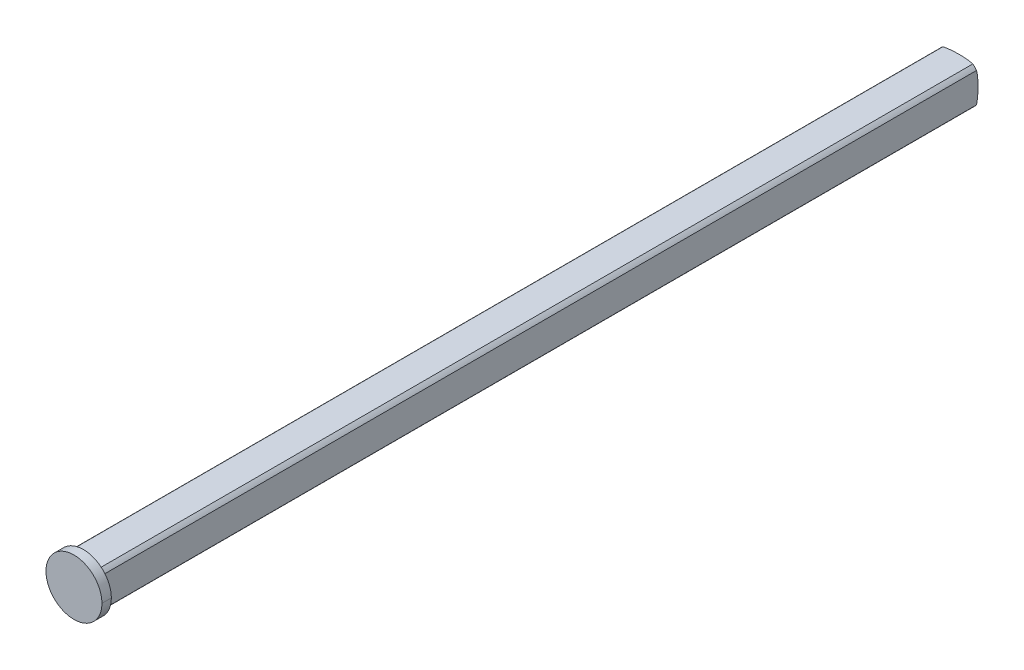
ISO-10303-21;
HEADER;
FILE_DESCRIPTION(('STEP AP214'),'2;1');
FILE_NAME('part.step','',(''),(''),'','','');
FILE_SCHEMA(('AUTOMOTIVE_DESIGN { 1 0 10303 214 1 1 1 1 }'));
ENDSEC;
DATA;
#1=APPLICATION_CONTEXT('core data for automotive mechanical design processes');
#2=APPLICATION_PROTOCOL_DEFINITION('international standard','automotive_design',2000,#1);
#3=PRODUCT_CONTEXT('',#1,'mechanical');
#4=PRODUCT('Part','Part','',(#3));
#5=PRODUCT_RELATED_PRODUCT_CATEGORY('part','',(#4));
#6=PRODUCT_DEFINITION_FORMATION('','',#4);
#7=PRODUCT_DEFINITION_CONTEXT('part definition',#1,'design');
#8=PRODUCT_DEFINITION('design','',#6,#7);
#9=PRODUCT_DEFINITION_SHAPE('','',#8);
#10=(LENGTH_UNIT() NAMED_UNIT(*) SI_UNIT(.MILLI.,.METRE.));
#11=(NAMED_UNIT(*) PLANE_ANGLE_UNIT() SI_UNIT($,.RADIAN.));
#12=(NAMED_UNIT(*) SI_UNIT($,.STERADIAN.) SOLID_ANGLE_UNIT());
#13=UNCERTAINTY_MEASURE_WITH_UNIT(LENGTH_MEASURE(1.E-05),#10,'distance_accuracy_value','');
#14=(GEOMETRIC_REPRESENTATION_CONTEXT(3) GLOBAL_UNCERTAINTY_ASSIGNED_CONTEXT((#13)) GLOBAL_UNIT_ASSIGNED_CONTEXT((#10,
#11,#12)) REPRESENTATION_CONTEXT('',''));
#15=CARTESIAN_POINT('',(0.,0.,0.));
#16=DIRECTION('',(0.,0.,1.));
#17=DIRECTION('',(1.,0.,0.));
#18=AXIS2_PLACEMENT_3D('',#15,#16,#17);
#19=CARTESIAN_POINT('',(0.,0.,-74.422));
#20=DIRECTION('',(0.,0.,1.));
#21=DIRECTION('',(1.,0.,0.));
#22=AXIS2_PLACEMENT_3D('',#19,#20,#21);
#23=CYLINDRICAL_SURFACE('',#22,2.032);
#24=DIRECTION('',(0.,0.,-1.));
#25=VECTOR('',#24,1.);
#26=CARTESIAN_POINT('',(1.5875,1.26841150657032,-74.422));
#27=LINE('',#26,#25);
#28=CARTESIAN_POINT('',(1.5875,1.26841150657032,0.));
#29=VERTEX_POINT('',#28);
#30=CARTESIAN_POINT('',(1.5875,1.26841150657032,-74.270919142098));
#31=VERTEX_POINT('',#30);
#32=EDGE_CURVE('P0_E145',#29,#31,#27,.T.);
#33=ORIENTED_EDGE('',*,*,#32,.T.);
#34=CARTESIAN_POINT('',(0.,0.,-74.270919142098));
#35=DIRECTION('',(0.,0.,1.));
#36=DIRECTION('',(1.,0.,0.));
#37=AXIS2_PLACEMENT_3D('',#34,#35,#36);
#38=CIRCLE('',#37,2.032);
#39=CARTESIAN_POINT('',(1.26841150657032,1.5875,-74.270919142098));
#40=VERTEX_POINT('',#39);
#41=EDGE_CURVE('P0_E160',#31,#40,#38,.T.);
#42=ORIENTED_EDGE('',*,*,#41,.T.);
#43=DIRECTION('',(0.,0.,1.));
#44=VECTOR('',#43,1.);
#45=CARTESIAN_POINT('',(1.26841150657032,1.5875,-74.422));
#46=LINE('',#45,#44);
#47=CARTESIAN_POINT('',(1.26841150657032,1.5875,0.));
#48=VERTEX_POINT('',#47);
#49=EDGE_CURVE('P0_E194',#40,#48,#46,.T.);
#50=ORIENTED_EDGE('',*,*,#49,.T.);
#51=CARTESIAN_POINT('',(0.,0.,0.));
#52=DIRECTION('',(0.,0.,1.));
#53=DIRECTION('',(1.,0.,0.));
#54=AXIS2_PLACEMENT_3D('',#51,#52,#53);
#55=CIRCLE('',#54,2.032);
#56=EDGE_CURVE('P0_E316',#29,#48,#55,.T.);
#57=ORIENTED_EDGE('',*,*,#56,.F.);
#58=EDGE_LOOP('',(#33,#42,#50,#57));
#59=FACE_BOUND('',#58,.T.);
#60=ADVANCED_FACE('P0_F17',(#59),#23,.T.);
#61=CARTESIAN_POINT('',(0.,0.,-74.422));
#62=DIRECTION('',(0.,0.,1.));
#63=DIRECTION('',(1.,0.,0.));
#64=AXIS2_PLACEMENT_3D('',#61,#62,#63);
#65=CYLINDRICAL_SURFACE('',#64,2.032);
#66=DIRECTION('',(0.,0.,1.));
#67=VECTOR('',#66,1.);
#68=CARTESIAN_POINT('',(-1.5875,1.26841150657032,-74.422));
#69=LINE('',#68,#67);
#70=CARTESIAN_POINT('',(-1.5875,1.26841150657032,-74.270919142098));
#71=VERTEX_POINT('',#70);
#72=CARTESIAN_POINT('',(-1.5875,1.26841150657032,0.));
#73=VERTEX_POINT('',#72);
#74=EDGE_CURVE('P0_E154',#71,#73,#69,.T.);
#75=ORIENTED_EDGE('',*,*,#74,.T.);
#76=CARTESIAN_POINT('',(0.,0.,0.));
#77=DIRECTION('',(0.,0.,1.));
#78=DIRECTION('',(1.,0.,0.));
#79=AXIS2_PLACEMENT_3D('',#76,#77,#78);
#80=CIRCLE('',#79,2.032);
#81=CARTESIAN_POINT('',(-1.26841150657032,1.5875,0.));
#82=VERTEX_POINT('',#81);
#83=EDGE_CURVE('P0_E44',#82,#73,#80,.T.);
#84=ORIENTED_EDGE('',*,*,#83,.F.);
#85=DIRECTION('',(0.,0.,-1.));
#86=VECTOR('',#85,1.);
#87=CARTESIAN_POINT('',(-1.26841150657032,1.5875,-74.422));
#88=LINE('',#87,#86);
#89=CARTESIAN_POINT('',(-1.26841150657032,1.5875,-74.270919142098));
#90=VERTEX_POINT('',#89);
#91=EDGE_CURVE('P0_E203',#82,#90,#88,.T.);
#92=ORIENTED_EDGE('',*,*,#91,.T.);
#93=CARTESIAN_POINT('',(0.,0.,-74.270919142098));
#94=DIRECTION('',(0.,0.,1.));
#95=DIRECTION('',(1.,0.,0.));
#96=AXIS2_PLACEMENT_3D('',#93,#94,#95);
#97=CIRCLE('',#96,2.032);
#98=EDGE_CURVE('P0_E212',#90,#71,#97,.T.);
#99=ORIENTED_EDGE('',*,*,#98,.T.);
#100=EDGE_LOOP('',(#75,#84,#92,#99));
#101=FACE_BOUND('',#100,.T.);
#102=ADVANCED_FACE('P0_F236',(#101),#65,.T.);
#103=CARTESIAN_POINT('',(0.,0.,-74.422));
#104=DIRECTION('',(0.,0.,1.));
#105=DIRECTION('',(1.,0.,0.));
#106=AXIS2_PLACEMENT_3D('',#103,#104,#105);
#107=CYLINDRICAL_SURFACE('',#106,2.032);
#108=DIRECTION('',(0.,0.,-1.));
#109=VECTOR('',#108,1.);
#110=CARTESIAN_POINT('',(-1.5875,-1.26841150657032,-74.422));
#111=LINE('',#110,#109);
#112=CARTESIAN_POINT('',(-1.5875,-1.26841150657032,0.));
#113=VERTEX_POINT('',#112);
#114=CARTESIAN_POINT('',(-1.5875,-1.26841150657032,-74.270919142098));
#115=VERTEX_POINT('',#114);
#116=EDGE_CURVE('P0_E264',#113,#115,#111,.T.);
#117=ORIENTED_EDGE('',*,*,#116,.T.);
#118=CARTESIAN_POINT('',(0.,0.,-74.270919142098));
#119=DIRECTION('',(0.,0.,1.));
#120=DIRECTION('',(1.,0.,0.));
#121=AXIS2_PLACEMENT_3D('',#118,#119,#120);
#122=CIRCLE('',#121,2.032);
#123=CARTESIAN_POINT('',(-1.26841150657032,-1.5875,-74.270919142098));
#124=VERTEX_POINT('',#123);
#125=EDGE_CURVE('P0_E11',#115,#124,#122,.T.);
#126=ORIENTED_EDGE('',*,*,#125,.T.);
#127=DIRECTION('',(0.,0.,1.));
#128=VECTOR('',#127,1.);
#129=CARTESIAN_POINT('',(-1.26841150657032,-1.5875,-74.422));
#130=LINE('',#129,#128);
#131=CARTESIAN_POINT('',(-1.26841150657032,-1.5875,0.));
#132=VERTEX_POINT('',#131);
#133=EDGE_CURVE('P0_E277',#124,#132,#130,.T.);
#134=ORIENTED_EDGE('',*,*,#133,.T.);
#135=CARTESIAN_POINT('',(0.,0.,0.));
#136=DIRECTION('',(0.,0.,1.));
#137=DIRECTION('',(1.,0.,0.));
#138=AXIS2_PLACEMENT_3D('',#135,#136,#137);
#139=CIRCLE('',#138,2.032);
#140=EDGE_CURVE('P0_E299',#113,#132,#139,.T.);
#141=ORIENTED_EDGE('',*,*,#140,.F.);
#142=EDGE_LOOP('',(#117,#126,#134,#141));
#143=FACE_BOUND('',#142,.T.);
#144=ADVANCED_FACE('P0_F372',(#143),#107,.T.);
#145=CARTESIAN_POINT('',(0.,0.,-74.422));
#146=DIRECTION('',(0.,0.,1.));
#147=DIRECTION('',(1.,0.,0.));
#148=AXIS2_PLACEMENT_3D('',#145,#146,#147);
#149=CYLINDRICAL_SURFACE('',#148,2.032);
#150=DIRECTION('',(0.,0.,-1.));
#151=VECTOR('',#150,1.);
#152=CARTESIAN_POINT('',(1.26841150657032,-1.5875,-74.422));
#153=LINE('',#152,#151);
#154=CARTESIAN_POINT('',(1.26841150657032,-1.5875,0.));
#155=VERTEX_POINT('',#154);
#156=CARTESIAN_POINT('',(1.26841150657032,-1.5875,-74.270919142098));
#157=VERTEX_POINT('',#156);
#158=EDGE_CURVE('P0_E319',#155,#157,#153,.T.);
#159=ORIENTED_EDGE('',*,*,#158,.T.);
#160=CARTESIAN_POINT('',(0.,0.,-74.270919142098));
#161=DIRECTION('',(0.,0.,1.));
#162=DIRECTION('',(1.,0.,0.));
#163=AXIS2_PLACEMENT_3D('',#160,#161,#162);
#164=CIRCLE('',#163,2.032);
#165=CARTESIAN_POINT('',(1.5875,-1.26841150657032,-74.270919142098));
#166=VERTEX_POINT('',#165);
#167=EDGE_CURVE('P0_E29',#157,#166,#164,.T.);
#168=ORIENTED_EDGE('',*,*,#167,.T.);
#169=DIRECTION('',(0.,0.,1.));
#170=VECTOR('',#169,1.);
#171=CARTESIAN_POINT('',(1.5875,-1.26841150657032,-74.422));
#172=LINE('',#171,#170);
#173=CARTESIAN_POINT('',(1.5875,-1.26841150657032,0.));
#174=VERTEX_POINT('',#173);
#175=EDGE_CURVE('P0_E141',#166,#174,#172,.T.);
#176=ORIENTED_EDGE('',*,*,#175,.T.);
#177=CARTESIAN_POINT('',(0.,0.,0.));
#178=DIRECTION('',(0.,0.,1.));
#179=DIRECTION('',(1.,0.,0.));
#180=AXIS2_PLACEMENT_3D('',#177,#178,#179);
#181=CIRCLE('',#180,2.032);
#182=EDGE_CURVE('P0_E309',#155,#174,#181,.T.);
#183=ORIENTED_EDGE('',*,*,#182,.F.);
#184=EDGE_LOOP('',(#159,#168,#176,#183));
#185=FACE_BOUND('',#184,.T.);
#186=ADVANCED_FACE('P0_F368',(#185),#149,.T.);
#187=CARTESIAN_POINT('',(-1.5875,1.5875,-74.422));
#188=DIRECTION('',(0.,0.,-1.));
#189=DIRECTION('',(0.,-1.,0.));
#190=AXIS2_PLACEMENT_3D('',#187,#188,#189);
#191=PLANE('',#190);
#192=CARTESIAN_POINT('',(0.,0.,-74.422));
#193=DIRECTION('',(0.,0.,1.));
#194=DIRECTION('',(1.,0.,0.));
#195=AXIS2_PLACEMENT_3D('',#192,#193,#194);
#196=CIRCLE('',#195,1.24506403026729);
#197=CARTESIAN_POINT('',(1.24506403026729,0.,-74.422));
#198=VERTEX_POINT('',#197);
#199=CARTESIAN_POINT('',(-1.24506403026729,0.,-74.422));
#200=VERTEX_POINT('',#199);
#201=EDGE_CURVE('P0_E261',#198,#200,#196,.T.);
#202=ORIENTED_EDGE('',*,*,#201,.F.);
#203=CARTESIAN_POINT('',(0.,0.,-74.422));
#204=DIRECTION('',(0.,0.,1.));
#205=DIRECTION('',(1.,0.,0.));
#206=AXIS2_PLACEMENT_3D('',#203,#204,#205);
#207=CIRCLE('',#206,1.24506403026729);
#208=EDGE_CURVE('P0_E122',#200,#198,#207,.T.);
#209=ORIENTED_EDGE('',*,*,#208,.F.);
#210=EDGE_LOOP('',(#202,#209));
#211=FACE_BOUND('',#210,.T.);
#212=ADVANCED_FACE('P0_F371',(#211),#191,.T.);
#213=CARTESIAN_POINT('',(0.,0.,-72.297));
#214=DIRECTION('',(0.,0.,1.));
#215=DIRECTION('',(1.,0.,0.));
#216=AXIS2_PLACEMENT_3D('',#213,#214,#215);
#217=DEGENERATE_TOROIDAL_SURFACE('',#216,1.24506403026729,2.125,.T.);
#218=CARTESIAN_POINT('',(-1.24506403026729,0.,-72.297));
#219=DIRECTION('',(0.,1.,0.));
#220=DIRECTION('',(-1.,0.,0.));
#221=AXIS2_PLACEMENT_3D('',#218,#219,#220);
#222=CIRCLE('',#221,2.125);
#223=CARTESIAN_POINT('',(-1.5875,0.,-74.3942273616929));
#224=VERTEX_POINT('',#223);
#225=EDGE_CURVE('P0_E253',#200,#224,#222,.T.);
#226=ORIENTED_EDGE('',*,*,#225,.F.);
#227=ORIENTED_EDGE('',*,*,#208,.T.);
#228=CARTESIAN_POINT('',(1.24506403026729,0.,-72.297));
#229=DIRECTION('',(0.,-1.,0.));
#230=DIRECTION('',(0.,0.,-1.));
#231=AXIS2_PLACEMENT_3D('',#228,#229,#230);
#232=CIRCLE('',#231,2.125);
#233=CARTESIAN_POINT('',(1.5875,0.,-74.3942273616929));
#234=VERTEX_POINT('',#233);
#235=EDGE_CURVE('P0_E149',#198,#234,#232,.T.);
#236=ORIENTED_EDGE('',*,*,#235,.T.);
#237=CARTESIAN_POINT('',(1.5875,-1.26841150657032,-74.270919142098));
#238=CARTESIAN_POINT('',(1.5875,-0.987077094928352,-74.340930639131));
#239=CARTESIAN_POINT('',(1.5875,-0.639530459017568,-74.3701819538896));
#240=CARTESIAN_POINT('',(1.5875,-0.353837297528294,-74.3942273616929));
#241=CARTESIAN_POINT('',(1.5875,0.,-74.3942273616929));
#242=B_SPLINE_CURVE_WITH_KNOTS('',2,(#237,#238,#239,#240,#241),.UNSPECIFIED.,.F.,.F.,(3,2,3),
(0.,0.5,1.),.UNSPECIFIED.);
#243=EDGE_CURVE('P0_E131',#166,#234,#242,.T.);
#244=ORIENTED_EDGE('',*,*,#243,.F.);
#245=ORIENTED_EDGE('',*,*,#167,.F.);
#246=CARTESIAN_POINT('',(-1.26841150657032,-1.5875,-74.270919142098));
#247=CARTESIAN_POINT('',(-0.770338232200867,-1.5875,-74.3948672057821));
#248=CARTESIAN_POINT('',(0.00849337593367507,-1.5875,-74.3942236517903));
#249=CARTESIAN_POINT('',(0.775470990407785,-1.5875,-74.3935898928361));
#250=CARTESIAN_POINT('',(1.26841150657033,-1.5875,-74.270919142098));
#251=B_SPLINE_CURVE_WITH_KNOTS('',2,(#246,#247,#248,#249,#250),.UNSPECIFIED.,.F.,.F.,(3,2,3),
(0.,0.5,1.),.UNSPECIFIED.);
#252=EDGE_CURVE('P0_E328',#124,#157,#251,.T.);
#253=ORIENTED_EDGE('',*,*,#252,.F.);
#254=ORIENTED_EDGE('',*,*,#125,.F.);
#255=CARTESIAN_POINT('',(-1.5875,0.,-74.3942273616929));
#256=CARTESIAN_POINT('',(-1.5875,-0.353179957370228,-74.3942273616929));
#257=CARTESIAN_POINT('',(-1.5875,-0.639529322286498,-74.3701820494506));
#258=CARTESIAN_POINT('',(-1.5875,-0.98666984322562,-74.341031985785));
#259=CARTESIAN_POINT('',(-1.5875,-1.26841150657032,-74.270919142098));
#260=B_SPLINE_CURVE_WITH_KNOTS('',2,(#255,#256,#257,#258,#259),.UNSPECIFIED.,.F.,.F.,(3,2,3),
(0.,0.5,1.),.UNSPECIFIED.);
#261=EDGE_CURVE('P0_E108',#224,#115,#260,.T.);
#262=ORIENTED_EDGE('',*,*,#261,.F.);
#263=EDGE_LOOP('',(#226,#227,#236,#244,#245,#253,#254,#262));
#264=FACE_BOUND('',#263,.T.);
#265=ADVANCED_FACE('P0_F150',(#264),#217,.T.);
#266=CARTESIAN_POINT('',(-1.5875,1.5875,0.));
#267=DIRECTION('',(0.,0.,-1.));
#268=DIRECTION('',(0.,-1.,0.));
#269=AXIS2_PLACEMENT_3D('',#266,#267,#268);
#270=PLANE('',#269);
#271=ORIENTED_EDGE('',*,*,#83,.T.);
#272=DIRECTION('',(0.,-1.,0.));
#273=VECTOR('',#272,1.);
#274=CARTESIAN_POINT('',(-1.5875,-1.5875,0.));
#275=LINE('',#274,#273);
#276=EDGE_CURVE('P0_E268',#73,#113,#275,.T.);
#277=ORIENTED_EDGE('',*,*,#276,.T.);
#278=ORIENTED_EDGE('',*,*,#140,.T.);
#279=DIRECTION('',(1.,0.,0.));
#280=VECTOR('',#279,1.);
#281=CARTESIAN_POINT('',(-1.5875,-1.5875,0.));
#282=LINE('',#281,#280);
#283=EDGE_CURVE('P0_E317',#132,#155,#282,.T.);
#284=ORIENTED_EDGE('',*,*,#283,.T.);
#285=ORIENTED_EDGE('',*,*,#182,.T.);
#286=DIRECTION('',(0.,1.,0.));
#287=VECTOR('',#286,1.);
#288=CARTESIAN_POINT('',(1.5875,-1.5875,0.));
#289=LINE('',#288,#287);
#290=EDGE_CURVE('P0_E204',#174,#29,#289,.T.);
#291=ORIENTED_EDGE('',*,*,#290,.T.);
#292=ORIENTED_EDGE('',*,*,#56,.T.);
#293=DIRECTION('',(-1.,0.,0.));
#294=VECTOR('',#293,1.);
#295=CARTESIAN_POINT('',(-1.5875,1.5875,0.));
#296=LINE('',#295,#294);
#297=EDGE_CURVE('P0_E209',#48,#82,#296,.T.);
#298=ORIENTED_EDGE('',*,*,#297,.T.);
#299=EDGE_LOOP('',(#271,#277,#278,#284,#285,#291,#292,#298));
#300=FACE_BOUND('',#299,.T.);
#301=ADVANCED_FACE('P0_F181',(#300),#270,.F.);
#302=CARTESIAN_POINT('',(-1.5875,1.5875,0.));
#303=DIRECTION('',(0.,-1.,0.));
#304=DIRECTION('',(0.,0.,-1.));
#305=AXIS2_PLACEMENT_3D('',#302,#303,#304);
#306=PLANE('',#305);
#307=ORIENTED_EDGE('',*,*,#49,.F.);
#308=CARTESIAN_POINT('',(1.26841150657033,1.5875,-74.270919142098));
#309=CARTESIAN_POINT('',(0.77033823220087,1.5875,-74.3948672057821));
#310=CARTESIAN_POINT('',(-0.00849337593367486,1.5875,-74.3942236517903));
#311=CARTESIAN_POINT('',(-0.775470990407782,1.5875,-74.3935898928361));
#312=CARTESIAN_POINT('',(-1.26841150657032,1.5875,-74.270919142098));
#313=B_SPLINE_CURVE_WITH_KNOTS('',2,(#308,#309,#310,#311,#312),.UNSPECIFIED.,.F.,.F.,(3,2,3),
(0.,0.5,1.),.UNSPECIFIED.);
#314=EDGE_CURVE('P0_E216',#40,#90,#313,.T.);
#315=ORIENTED_EDGE('',*,*,#314,.T.);
#316=ORIENTED_EDGE('',*,*,#91,.F.);
#317=ORIENTED_EDGE('',*,*,#297,.F.);
#318=EDGE_LOOP('',(#307,#315,#316,#317));
#319=FACE_BOUND('',#318,.T.);
#320=ADVANCED_FACE('P0_F385',(#319),#306,.F.);
#321=CARTESIAN_POINT('',(1.5875,-1.5875,0.));
#322=DIRECTION('',(-1.,0.,0.));
#323=DIRECTION('',(0.,0.,1.));
#324=AXIS2_PLACEMENT_3D('',#321,#322,#323);
#325=PLANE('',#324);
#326=ORIENTED_EDGE('',*,*,#175,.F.);
#327=ORIENTED_EDGE('',*,*,#243,.T.);
#328=CARTESIAN_POINT('',(1.5875,0.,-74.3942273616929));
#329=CARTESIAN_POINT('',(1.5875,0.353179957370285,-74.3942273616929));
#330=CARTESIAN_POINT('',(1.5875,0.6395293222865,-74.3701820494506));
#331=CARTESIAN_POINT('',(1.5875,0.986669843225655,-74.341031985785));
#332=CARTESIAN_POINT('',(1.5875,1.26841150657033,-74.270919142098));
#333=B_SPLINE_CURVE_WITH_KNOTS('',2,(#328,#329,#330,#331,#332),.UNSPECIFIED.,.F.,.F.,(3,2,3),
(0.,0.5,1.),.UNSPECIFIED.);
#334=EDGE_CURVE('P0_E136',#234,#31,#333,.T.);
#335=ORIENTED_EDGE('',*,*,#334,.T.);
#336=ORIENTED_EDGE('',*,*,#32,.F.);
#337=ORIENTED_EDGE('',*,*,#290,.F.);
#338=EDGE_LOOP('',(#326,#327,#335,#336,#337));
#339=FACE_BOUND('',#338,.T.);
#340=ADVANCED_FACE('P0_F19',(#339),#325,.F.);
#341=CARTESIAN_POINT('',(-1.5875,-1.5875,0.));
#342=DIRECTION('',(0.,1.,0.));
#343=DIRECTION('',(1.,0.,0.));
#344=AXIS2_PLACEMENT_3D('',#341,#342,#343);
#345=PLANE('',#344);
#346=ORIENTED_EDGE('',*,*,#133,.F.);
#347=ORIENTED_EDGE('',*,*,#252,.T.);
#348=ORIENTED_EDGE('',*,*,#158,.F.);
#349=ORIENTED_EDGE('',*,*,#283,.F.);
#350=EDGE_LOOP('',(#346,#347,#348,#349));
#351=FACE_BOUND('',#350,.T.);
#352=ADVANCED_FACE('P0_F235',(#351),#345,.F.);
#353=CARTESIAN_POINT('',(-1.5875,-1.5875,0.));
#354=DIRECTION('',(1.,0.,0.));
#355=DIRECTION('',(0.,1.,0.));
#356=AXIS2_PLACEMENT_3D('',#353,#354,#355);
#357=PLANE('',#356);
#358=ORIENTED_EDGE('',*,*,#74,.F.);
#359=CARTESIAN_POINT('',(-1.5875,1.26841150657033,-74.270919142098));
#360=CARTESIAN_POINT('',(-1.5875,0.98707709492837,-74.340930639131));
#361=CARTESIAN_POINT('',(-1.5875,0.63953045901757,-74.3701819538896));
#362=CARTESIAN_POINT('',(-1.5875,0.353837297528325,-74.3942273616929));
#363=CARTESIAN_POINT('',(-1.5875,0.,-74.3942273616929));
#364=B_SPLINE_CURVE_WITH_KNOTS('',2,(#359,#360,#361,#362,#363),.UNSPECIFIED.,.F.,.F.,(3,2,3),
(0.,0.5,1.),.UNSPECIFIED.);
#365=EDGE_CURVE('P0_E217',#71,#224,#364,.T.);
#366=ORIENTED_EDGE('',*,*,#365,.T.);
#367=ORIENTED_EDGE('',*,*,#261,.T.);
#368=ORIENTED_EDGE('',*,*,#116,.F.);
#369=ORIENTED_EDGE('',*,*,#276,.F.);
#370=EDGE_LOOP('',(#358,#366,#367,#368,#369));
#371=FACE_BOUND('',#370,.T.);
#372=ADVANCED_FACE('P0_F180',(#371),#357,.F.);
#373=CARTESIAN_POINT('',(0.,0.,-72.297));
#374=DIRECTION('',(0.,0.,1.));
#375=DIRECTION('',(1.,0.,0.));
#376=AXIS2_PLACEMENT_3D('',#373,#374,#375);
#377=DEGENERATE_TOROIDAL_SURFACE('',#376,1.24506403026729,2.125,.T.);
#378=ORIENTED_EDGE('',*,*,#201,.T.);
#379=ORIENTED_EDGE('',*,*,#225,.T.);
#380=ORIENTED_EDGE('',*,*,#365,.F.);
#381=ORIENTED_EDGE('',*,*,#98,.F.);
#382=ORIENTED_EDGE('',*,*,#314,.F.);
#383=ORIENTED_EDGE('',*,*,#41,.F.);
#384=ORIENTED_EDGE('',*,*,#334,.F.);
#385=ORIENTED_EDGE('',*,*,#235,.F.);
#386=EDGE_LOOP('',(#378,#379,#380,#381,#382,#383,#384,#385));
#387=FACE_BOUND('',#386,.T.);
#388=ADVANCED_FACE('P0_F157',(#387),#377,.T.);
#389=CLOSED_SHELL('',(#60,#102,#144,#186,#212,#265,#301,#320,#340,#352,#372,#388));
#390=MANIFOLD_SOLID_BREP('P0_B1',#389);
#391=CARTESIAN_POINT('',(0.,0.,0.));
#392=DIRECTION('',(0.,0.,1.));
#393=DIRECTION('',(1.,0.,0.));
#394=AXIS2_PLACEMENT_3D('',#391,#392,#393);
#395=PLANE('',#394);
#396=CARTESIAN_POINT('',(0.,0.,0.));
#397=DIRECTION('',(0.,0.,1.));
#398=DIRECTION('',(1.,0.,0.));
#399=AXIS2_PLACEMENT_3D('',#396,#397,#398);
#400=CIRCLE('',#399,2.375);
#401=CARTESIAN_POINT('',(-2.375,0.,0.));
#402=VERTEX_POINT('',#401);
#403=CARTESIAN_POINT('',(2.375,0.,0.));
#404=VERTEX_POINT('',#403);
#405=EDGE_CURVE('P1_E11',#402,#404,#400,.T.);
#406=ORIENTED_EDGE('',*,*,#405,.F.);
#407=CARTESIAN_POINT('',(0.,0.,0.));
#408=DIRECTION('',(0.,0.,1.));
#409=DIRECTION('',(1.,0.,0.));
#410=AXIS2_PLACEMENT_3D('',#407,#408,#409);
#411=CIRCLE('',#410,2.375);
#412=EDGE_CURVE('P1_E68',#404,#402,#411,.T.);
#413=ORIENTED_EDGE('',*,*,#412,.F.);
#414=EDGE_LOOP('',(#406,#413));
#415=FACE_BOUND('',#414,.T.);
#416=ADVANCED_FACE('P1_F17',(#415),#395,.F.);
#417=CARTESIAN_POINT('',(0.,0.,0.8));
#418=DIRECTION('',(0.,0.,1.));
#419=DIRECTION('',(1.,0.,0.));
#420=AXIS2_PLACEMENT_3D('',#417,#418,#419);
#421=PLANE('',#420);
#422=CARTESIAN_POINT('',(0.,0.,0.8));
#423=DIRECTION('',(0.,0.,1.));
#424=DIRECTION('',(1.,0.,0.));
#425=AXIS2_PLACEMENT_3D('',#422,#423,#424);
#426=CIRCLE('',#425,2.375);
#427=CARTESIAN_POINT('',(-2.375,0.,0.8));
#428=VERTEX_POINT('',#427);
#429=CARTESIAN_POINT('',(2.375,0.,0.8));
#430=VERTEX_POINT('',#429);
#431=EDGE_CURVE('P1_E28',#428,#430,#426,.T.);
#432=ORIENTED_EDGE('',*,*,#431,.T.);
#433=CARTESIAN_POINT('',(0.,0.,0.8));
#434=DIRECTION('',(0.,0.,1.));
#435=DIRECTION('',(1.,0.,0.));
#436=AXIS2_PLACEMENT_3D('',#433,#434,#435);
#437=CIRCLE('',#436,2.375);
#438=EDGE_CURVE('P1_E21',#430,#428,#437,.T.);
#439=ORIENTED_EDGE('',*,*,#438,.T.);
#440=EDGE_LOOP('',(#432,#439));
#441=FACE_BOUND('',#440,.T.);
#442=ADVANCED_FACE('P1_F57',(#441),#421,.T.);
#443=CARTESIAN_POINT('',(0.,0.,0.8));
#444=DIRECTION('',(0.,0.,-1.));
#445=DIRECTION('',(-1.,0.,0.));
#446=AXIS2_PLACEMENT_3D('',#443,#444,#445);
#447=CYLINDRICAL_SURFACE('',#446,2.375);
#448=DIRECTION('',(0.,0.,-1.));
#449=VECTOR('',#448,1.);
#450=CARTESIAN_POINT('',(2.375,0.,0.8));
#451=LINE('',#450,#449);
#452=EDGE_CURVE('P1_E63',#430,#404,#451,.T.);
#453=ORIENTED_EDGE('',*,*,#452,.F.);
#454=ORIENTED_EDGE('',*,*,#431,.F.);
#455=DIRECTION('',(0.,0.,-1.));
#456=VECTOR('',#455,1.);
#457=CARTESIAN_POINT('',(-2.375,0.,0.8));
#458=LINE('',#457,#456);
#459=EDGE_CURVE('P1_E60',#428,#402,#458,.T.);
#460=ORIENTED_EDGE('',*,*,#459,.T.);
#461=ORIENTED_EDGE('',*,*,#405,.T.);
#462=EDGE_LOOP('',(#453,#454,#460,#461));
#463=FACE_BOUND('',#462,.T.);
#464=ADVANCED_FACE('P1_F64',(#463),#447,.T.);
#465=CARTESIAN_POINT('',(0.,0.,0.8));
#466=DIRECTION('',(0.,0.,-1.));
#467=DIRECTION('',(-1.,0.,0.));
#468=AXIS2_PLACEMENT_3D('',#465,#466,#467);
#469=CYLINDRICAL_SURFACE('',#468,2.375);
#470=ORIENTED_EDGE('',*,*,#438,.F.);
#471=ORIENTED_EDGE('',*,*,#452,.T.);
#472=ORIENTED_EDGE('',*,*,#412,.T.);
#473=ORIENTED_EDGE('',*,*,#459,.F.);
#474=EDGE_LOOP('',(#470,#471,#472,#473));
#475=FACE_BOUND('',#474,.T.);
#476=ADVANCED_FACE('P1_F19',(#475),#469,.T.);
#477=CLOSED_SHELL('',(#416,#442,#464,#476));
#478=MANIFOLD_SOLID_BREP('P1_B1',#477);
#479=ADVANCED_BREP_SHAPE_REPRESENTATION('',(#18,#390,#478),#14);
#480=SHAPE_DEFINITION_REPRESENTATION(#9,#479);
ENDSEC;
END-ISO-10303-21;
